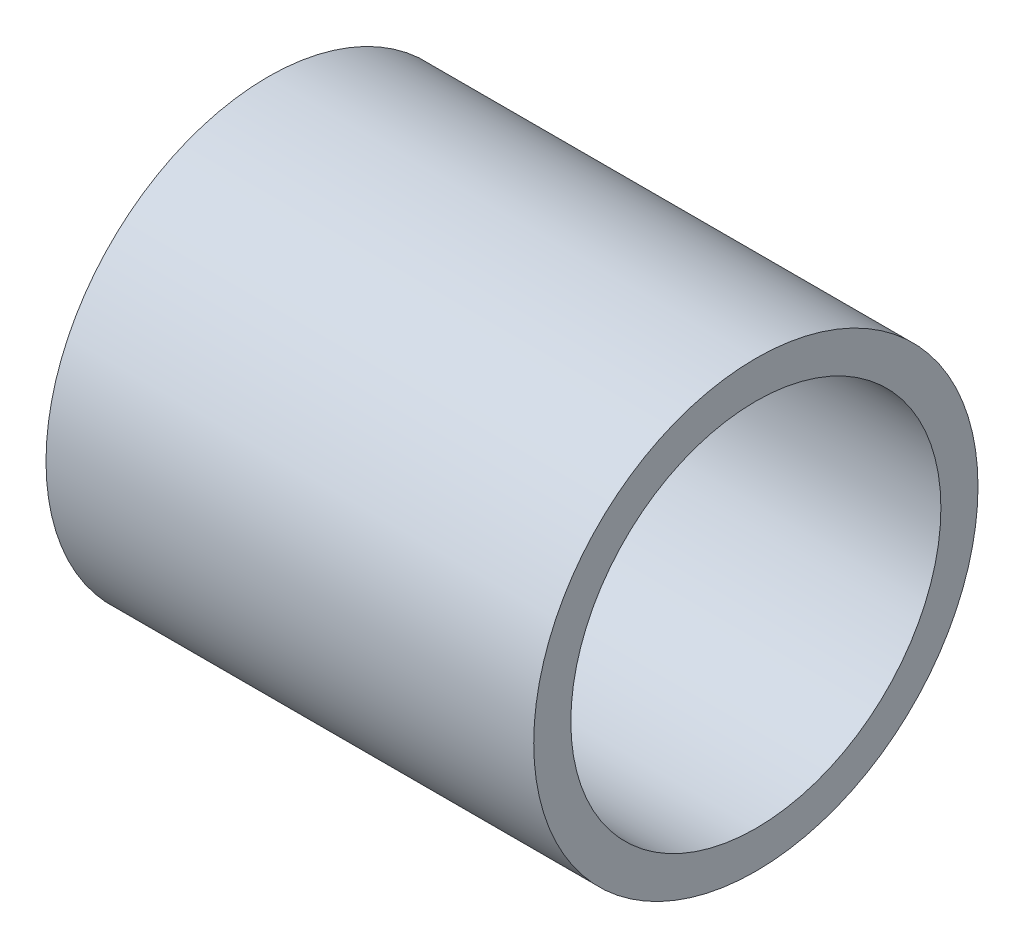
ISO-10303-21;
HEADER;
FILE_DESCRIPTION(('STEP AP214'),'2;1');
FILE_NAME('part.step','',(''),(''),'','','');
FILE_SCHEMA(('AUTOMOTIVE_DESIGN { 1 0 10303 214 1 1 1 1 }'));
ENDSEC;
DATA;
#1=APPLICATION_CONTEXT('core data for automotive mechanical design processes');
#2=APPLICATION_PROTOCOL_DEFINITION('international standard','automotive_design',2000,#1);
#3=PRODUCT_CONTEXT('',#1,'mechanical');
#4=PRODUCT('Part','Part','',(#3));
#5=PRODUCT_RELATED_PRODUCT_CATEGORY('part','',(#4));
#6=PRODUCT_DEFINITION_FORMATION('','',#4);
#7=PRODUCT_DEFINITION_CONTEXT('part definition',#1,'design');
#8=PRODUCT_DEFINITION('design','',#6,#7);
#9=PRODUCT_DEFINITION_SHAPE('','',#8);
#10=(LENGTH_UNIT() NAMED_UNIT(*) SI_UNIT(.MILLI.,.METRE.));
#11=(NAMED_UNIT(*) PLANE_ANGLE_UNIT() SI_UNIT($,.RADIAN.));
#12=(NAMED_UNIT(*) SI_UNIT($,.STERADIAN.) SOLID_ANGLE_UNIT());
#13=UNCERTAINTY_MEASURE_WITH_UNIT(LENGTH_MEASURE(1.E-05),#10,'distance_accuracy_value','');
#14=(GEOMETRIC_REPRESENTATION_CONTEXT(3) GLOBAL_UNCERTAINTY_ASSIGNED_CONTEXT((#13)) GLOBAL_UNIT_ASSIGNED_CONTEXT((#10,
#11,#12)) REPRESENTATION_CONTEXT('',''));
#15=CARTESIAN_POINT('',(0.,0.,0.));
#16=DIRECTION('',(0.,0.,1.));
#17=DIRECTION('',(1.,0.,0.));
#18=AXIS2_PLACEMENT_3D('',#15,#16,#17);
#19=CARTESIAN_POINT('',(3.4925,0.,0.));
#20=DIRECTION('',(1.,0.,0.));
#21=DIRECTION('',(0.,0.,-1.));
#22=AXIS2_PLACEMENT_3D('',#19,#20,#21);
#23=PLANE('',#22);
#24=CARTESIAN_POINT('',(3.4925,0.,0.));
#25=DIRECTION('',(1.,0.,0.));
#26=DIRECTION('',(0.,0.,-1.));
#27=AXIS2_PLACEMENT_3D('',#24,#25,#26);
#28=CIRCLE('',#27,3.18135);
#29=CARTESIAN_POINT('',(3.4925,0.,-3.18135));
#30=VERTEX_POINT('',#29);
#31=EDGE_CURVE('E10',#30,#30,#28,.T.);
#32=ORIENTED_EDGE('',*,*,#31,.T.);
#33=EDGE_LOOP('',(#32));
#34=FACE_BOUND('',#33,.T.);
#35=CARTESIAN_POINT('',(3.4925,0.,0.));
#36=DIRECTION('',(1.,0.,0.));
#37=DIRECTION('',(0.,0.,-1.));
#38=AXIS2_PLACEMENT_3D('',#35,#36,#37);
#39=CIRCLE('',#38,2.65);
#40=CARTESIAN_POINT('',(3.4925,0.,-2.65));
#41=VERTEX_POINT('',#40);
#42=EDGE_CURVE('E51',#41,#41,#39,.T.);
#43=ORIENTED_EDGE('',*,*,#42,.F.);
#44=EDGE_LOOP('',(#43));
#45=FACE_BOUND('',#44,.T.);
#46=ADVANCED_FACE('F40',(#34,#45),#23,.T.);
#47=CARTESIAN_POINT('',(-3.4925,0.,0.));
#48=DIRECTION('',(1.,0.,0.));
#49=DIRECTION('',(0.,0.,-1.));
#50=AXIS2_PLACEMENT_3D('',#47,#48,#49);
#51=PLANE('',#50);
#52=CARTESIAN_POINT('',(-3.4925,0.,0.));
#53=DIRECTION('',(1.,0.,0.));
#54=DIRECTION('',(0.,0.,-1.));
#55=AXIS2_PLACEMENT_3D('',#52,#53,#54);
#56=CIRCLE('',#55,3.18135);
#57=CARTESIAN_POINT('',(-3.4925,0.,-3.18135));
#58=VERTEX_POINT('',#57);
#59=EDGE_CURVE('E44',#58,#58,#56,.T.);
#60=ORIENTED_EDGE('',*,*,#59,.F.);
#61=EDGE_LOOP('',(#60));
#62=FACE_BOUND('',#61,.T.);
#63=CARTESIAN_POINT('',(-3.4925,0.,0.));
#64=DIRECTION('',(1.,0.,0.));
#65=DIRECTION('',(0.,0.,-1.));
#66=AXIS2_PLACEMENT_3D('',#63,#64,#65);
#67=CIRCLE('',#66,2.65);
#68=CARTESIAN_POINT('',(-3.4925,0.,-2.65));
#69=VERTEX_POINT('',#68);
#70=EDGE_CURVE('E53',#69,#69,#67,.T.);
#71=ORIENTED_EDGE('',*,*,#70,.T.);
#72=EDGE_LOOP('',(#71));
#73=FACE_BOUND('',#72,.T.);
#74=ADVANCED_FACE('F63',(#62,#73),#51,.F.);
#75=CARTESIAN_POINT('',(3.4925,0.,0.));
#76=DIRECTION('',(-1.,0.,0.));
#77=DIRECTION('',(0.,0.,1.));
#78=AXIS2_PLACEMENT_3D('',#75,#76,#77);
#79=CYLINDRICAL_SURFACE('',#78,3.18135);
#80=ORIENTED_EDGE('',*,*,#31,.F.);
#81=EDGE_LOOP('',(#80));
#82=FACE_BOUND('',#81,.T.);
#83=ORIENTED_EDGE('',*,*,#59,.T.);
#84=EDGE_LOOP('',(#83));
#85=FACE_BOUND('',#84,.T.);
#86=ADVANCED_FACE('F42',(#82,#85),#79,.T.);
#87=CARTESIAN_POINT('',(3.4925,0.,0.));
#88=DIRECTION('',(-1.,0.,0.));
#89=DIRECTION('',(0.,0.,1.));
#90=AXIS2_PLACEMENT_3D('',#87,#88,#89);
#91=CYLINDRICAL_SURFACE('',#90,2.65);
#92=ORIENTED_EDGE('',*,*,#42,.T.);
#93=EDGE_LOOP('',(#92));
#94=FACE_BOUND('',#93,.T.);
#95=ORIENTED_EDGE('',*,*,#70,.F.);
#96=EDGE_LOOP('',(#95));
#97=FACE_BOUND('',#96,.T.);
#98=ADVANCED_FACE('F59',(#94,#97),#91,.F.);
#99=CLOSED_SHELL('',(#46,#74,#86,#98));
#100=MANIFOLD_SOLID_BREP('B2',#99);
#101=ADVANCED_BREP_SHAPE_REPRESENTATION('',(#18,#100),#14);
#102=SHAPE_DEFINITION_REPRESENTATION(#9,#101);
ENDSEC;
END-ISO-10303-21;
